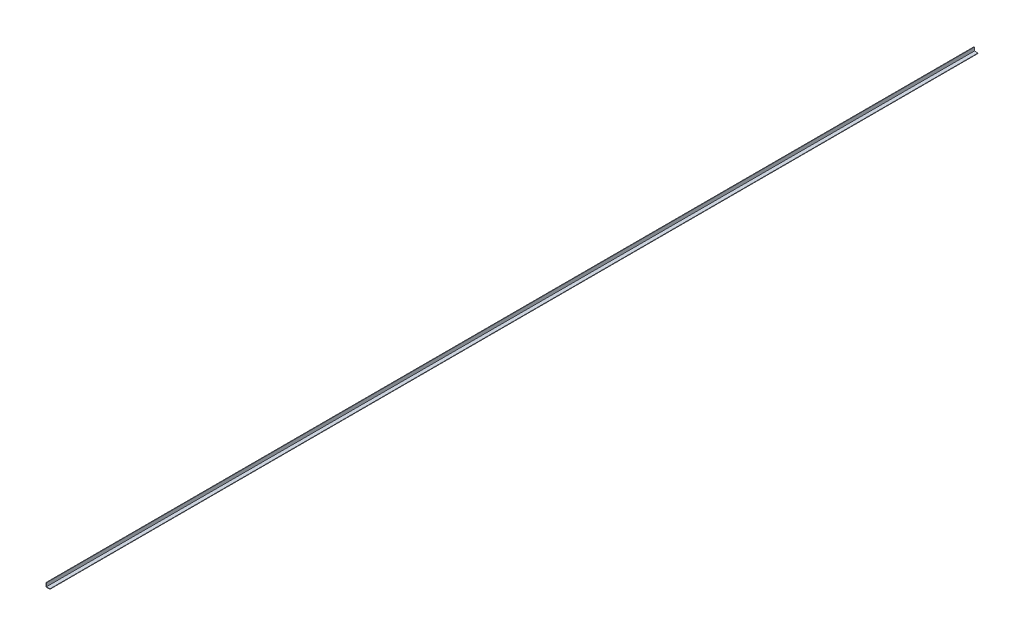
ISO-10303-21;
HEADER;
FILE_DESCRIPTION(('STEP AP214'),'2;1');
FILE_NAME('part.step','',(''),(''),'','','');
FILE_SCHEMA(('AUTOMOTIVE_DESIGN { 1 0 10303 214 1 1 1 1 }'));
ENDSEC;
DATA;
#1=APPLICATION_CONTEXT('core data for automotive mechanical design processes');
#2=APPLICATION_PROTOCOL_DEFINITION('international standard','automotive_design',2000,#1);
#3=PRODUCT_CONTEXT('',#1,'mechanical');
#4=PRODUCT('Part','Part','',(#3));
#5=PRODUCT_RELATED_PRODUCT_CATEGORY('part','',(#4));
#6=PRODUCT_DEFINITION_FORMATION('','',#4);
#7=PRODUCT_DEFINITION_CONTEXT('part definition',#1,'design');
#8=PRODUCT_DEFINITION('design','',#6,#7);
#9=PRODUCT_DEFINITION_SHAPE('','',#8);
#10=(LENGTH_UNIT() NAMED_UNIT(*) SI_UNIT(.MILLI.,.METRE.));
#11=(NAMED_UNIT(*) PLANE_ANGLE_UNIT() SI_UNIT($,.RADIAN.));
#12=(NAMED_UNIT(*) SI_UNIT($,.STERADIAN.) SOLID_ANGLE_UNIT());
#13=UNCERTAINTY_MEASURE_WITH_UNIT(LENGTH_MEASURE(1.E-05),#10,'distance_accuracy_value','');
#14=(GEOMETRIC_REPRESENTATION_CONTEXT(3) GLOBAL_UNCERTAINTY_ASSIGNED_CONTEXT((#13)) GLOBAL_UNIT_ASSIGNED_CONTEXT((#10,
#11,#12)) REPRESENTATION_CONTEXT('',''));
#15=CARTESIAN_POINT('',(0.,0.,0.));
#16=DIRECTION('',(0.,0.,1.));
#17=DIRECTION('',(1.,0.,0.));
#18=AXIS2_PLACEMENT_3D('',#15,#16,#17);
#19=CARTESIAN_POINT('',(2.7,25.8,-6100.));
#20=DIRECTION('',(0.,1.,0.));
#21=DIRECTION('',(0.,0.,1.));
#22=AXIS2_PLACEMENT_3D('',#19,#20,#21);
#23=PLANE('',#22);
#24=DIRECTION('',(-1.,0.,0.));
#25=VECTOR('',#24,1.);
#26=CARTESIAN_POINT('',(2.7,25.8,0.));
#27=LINE('',#26,#25);
#28=CARTESIAN_POINT('',(2.7,25.8,0.));
#29=VERTEX_POINT('',#28);
#30=CARTESIAN_POINT('',(0.,25.8,0.));
#31=VERTEX_POINT('',#30);
#32=EDGE_CURVE('E118',#29,#31,#27,.T.);
#33=ORIENTED_EDGE('',*,*,#32,.F.);
#34=DIRECTION('',(0.,0.,1.));
#35=VECTOR('',#34,1.);
#36=CARTESIAN_POINT('',(2.7,25.8,-6100.));
#37=LINE('',#36,#35);
#38=CARTESIAN_POINT('',(2.7,25.8,-6100.));
#39=VERTEX_POINT('',#38);
#40=EDGE_CURVE('E11',#39,#29,#37,.T.);
#41=ORIENTED_EDGE('',*,*,#40,.F.);
#42=DIRECTION('',(-1.,0.,0.));
#43=VECTOR('',#42,1.);
#44=CARTESIAN_POINT('',(2.7,25.8,-6100.));
#45=LINE('',#44,#43);
#46=CARTESIAN_POINT('',(0.,25.8,-6100.));
#47=VERTEX_POINT('',#46);
#48=EDGE_CURVE('E132',#39,#47,#45,.T.);
#49=ORIENTED_EDGE('',*,*,#48,.T.);
#50=DIRECTION('',(0.,0.,1.));
#51=VECTOR('',#50,1.);
#52=CARTESIAN_POINT('',(0.,25.8,-6100.));
#53=LINE('',#52,#51);
#54=EDGE_CURVE('E36',#47,#31,#53,.T.);
#55=ORIENTED_EDGE('',*,*,#54,.T.);
#56=EDGE_LOOP('',(#33,#41,#49,#55));
#57=FACE_BOUND('',#56,.T.);
#58=ADVANCED_FACE('F33',(#57),#23,.T.);
#59=CARTESIAN_POINT('',(2.7,2.7,-6100.));
#60=DIRECTION('',(1.,0.,0.));
#61=DIRECTION('',(0.,1.,0.));
#62=AXIS2_PLACEMENT_3D('',#59,#60,#61);
#63=PLANE('',#62);
#64=DIRECTION('',(0.,1.,0.));
#65=VECTOR('',#64,1.);
#66=CARTESIAN_POINT('',(2.7,2.7,0.));
#67=LINE('',#66,#65);
#68=CARTESIAN_POINT('',(2.7,2.7,0.));
#69=VERTEX_POINT('',#68);
#70=EDGE_CURVE('E130',#69,#29,#67,.T.);
#71=ORIENTED_EDGE('',*,*,#70,.F.);
#72=DIRECTION('',(0.,0.,1.));
#73=VECTOR('',#72,1.);
#74=CARTESIAN_POINT('',(2.7,2.7,-6100.));
#75=LINE('',#74,#73);
#76=CARTESIAN_POINT('',(2.7,2.7,-6100.));
#77=VERTEX_POINT('',#76);
#78=EDGE_CURVE('E42',#77,#69,#75,.T.);
#79=ORIENTED_EDGE('',*,*,#78,.F.);
#80=DIRECTION('',(0.,1.,0.));
#81=VECTOR('',#80,1.);
#82=CARTESIAN_POINT('',(2.7,2.7,-6100.));
#83=LINE('',#82,#81);
#84=EDGE_CURVE('E108',#77,#39,#83,.T.);
#85=ORIENTED_EDGE('',*,*,#84,.T.);
#86=ORIENTED_EDGE('',*,*,#40,.T.);
#87=EDGE_LOOP('',(#71,#79,#85,#86));
#88=FACE_BOUND('',#87,.T.);
#89=ADVANCED_FACE('F140',(#88),#63,.T.);
#90=CARTESIAN_POINT('',(25.8,2.7,-6100.));
#91=DIRECTION('',(0.,1.,0.));
#92=DIRECTION('',(-1.,0.,0.));
#93=AXIS2_PLACEMENT_3D('',#90,#91,#92);
#94=PLANE('',#93);
#95=DIRECTION('',(-1.,0.,0.));
#96=VECTOR('',#95,1.);
#97=CARTESIAN_POINT('',(25.8,2.7,0.));
#98=LINE('',#97,#96);
#99=CARTESIAN_POINT('',(25.8,2.7,0.));
#100=VERTEX_POINT('',#99);
#101=EDGE_CURVE('E95',#100,#69,#98,.T.);
#102=ORIENTED_EDGE('',*,*,#101,.F.);
#103=DIRECTION('',(0.,0.,1.));
#104=VECTOR('',#103,1.);
#105=CARTESIAN_POINT('',(25.8,2.7,-6100.));
#106=LINE('',#105,#104);
#107=CARTESIAN_POINT('',(25.8,2.7,-6100.));
#108=VERTEX_POINT('',#107);
#109=EDGE_CURVE('E90',#108,#100,#106,.T.);
#110=ORIENTED_EDGE('',*,*,#109,.F.);
#111=DIRECTION('',(-1.,0.,0.));
#112=VECTOR('',#111,1.);
#113=CARTESIAN_POINT('',(25.8,2.7,-6100.));
#114=LINE('',#113,#112);
#115=EDGE_CURVE('E93',#108,#77,#114,.T.);
#116=ORIENTED_EDGE('',*,*,#115,.T.);
#117=ORIENTED_EDGE('',*,*,#78,.T.);
#118=EDGE_LOOP('',(#102,#110,#116,#117));
#119=FACE_BOUND('',#118,.T.);
#120=ADVANCED_FACE('F92',(#119),#94,.T.);
#121=CARTESIAN_POINT('',(25.8,0.,-6100.));
#122=DIRECTION('',(1.,0.,0.));
#123=DIRECTION('',(0.,0.,-1.));
#124=AXIS2_PLACEMENT_3D('',#121,#122,#123);
#125=PLANE('',#124);
#126=DIRECTION('',(0.,1.,0.));
#127=VECTOR('',#126,1.);
#128=CARTESIAN_POINT('',(25.8,0.,0.));
#129=LINE('',#128,#127);
#130=CARTESIAN_POINT('',(25.8,0.,0.));
#131=VERTEX_POINT('',#130);
#132=EDGE_CURVE('E127',#131,#100,#129,.T.);
#133=ORIENTED_EDGE('',*,*,#132,.F.);
#134=DIRECTION('',(0.,0.,1.));
#135=VECTOR('',#134,1.);
#136=CARTESIAN_POINT('',(25.8,0.,-6100.));
#137=LINE('',#136,#135);
#138=CARTESIAN_POINT('',(25.8,0.,-6100.));
#139=VERTEX_POINT('',#138);
#140=EDGE_CURVE('E100',#139,#131,#137,.T.);
#141=ORIENTED_EDGE('',*,*,#140,.F.);
#142=DIRECTION('',(0.,1.,0.));
#143=VECTOR('',#142,1.);
#144=CARTESIAN_POINT('',(25.8,0.,-6100.));
#145=LINE('',#144,#143);
#146=EDGE_CURVE('E106',#139,#108,#145,.T.);
#147=ORIENTED_EDGE('',*,*,#146,.T.);
#148=ORIENTED_EDGE('',*,*,#109,.T.);
#149=EDGE_LOOP('',(#133,#141,#147,#148));
#150=FACE_BOUND('',#149,.T.);
#151=ADVANCED_FACE('F110',(#150),#125,.T.);
#152=CARTESIAN_POINT('',(0.,0.,-6100.));
#153=DIRECTION('',(0.,-1.,0.));
#154=DIRECTION('',(0.,0.,-1.));
#155=AXIS2_PLACEMENT_3D('',#152,#153,#154);
#156=PLANE('',#155);
#157=DIRECTION('',(1.,0.,0.));
#158=VECTOR('',#157,1.);
#159=CARTESIAN_POINT('',(0.,0.,0.));
#160=LINE('',#159,#158);
#161=CARTESIAN_POINT('',(0.,0.,0.));
#162=VERTEX_POINT('',#161);
#163=EDGE_CURVE('E124',#162,#131,#160,.T.);
#164=ORIENTED_EDGE('',*,*,#163,.F.);
#165=DIRECTION('',(0.,0.,1.));
#166=VECTOR('',#165,1.);
#167=CARTESIAN_POINT('',(0.,0.,-6100.));
#168=LINE('',#167,#166);
#169=CARTESIAN_POINT('',(0.,0.,-6100.));
#170=VERTEX_POINT('',#169);
#171=EDGE_CURVE('E135',#170,#162,#168,.T.);
#172=ORIENTED_EDGE('',*,*,#171,.F.);
#173=DIRECTION('',(1.,0.,0.));
#174=VECTOR('',#173,1.);
#175=CARTESIAN_POINT('',(0.,0.,-6100.));
#176=LINE('',#175,#174);
#177=EDGE_CURVE('E111',#170,#139,#176,.T.);
#178=ORIENTED_EDGE('',*,*,#177,.T.);
#179=ORIENTED_EDGE('',*,*,#140,.T.);
#180=EDGE_LOOP('',(#164,#172,#178,#179));
#181=FACE_BOUND('',#180,.T.);
#182=ADVANCED_FACE('F153',(#181),#156,.T.);
#183=CARTESIAN_POINT('',(0.,25.8,-6100.));
#184=DIRECTION('',(-1.,0.,0.));
#185=DIRECTION('',(0.,-1.,0.));
#186=AXIS2_PLACEMENT_3D('',#183,#184,#185);
#187=PLANE('',#186);
#188=DIRECTION('',(0.,-1.,0.));
#189=VECTOR('',#188,1.);
#190=CARTESIAN_POINT('',(0.,25.8,0.));
#191=LINE('',#190,#189);
#192=EDGE_CURVE('E121',#31,#162,#191,.T.);
#193=ORIENTED_EDGE('',*,*,#192,.F.);
#194=ORIENTED_EDGE('',*,*,#54,.F.);
#195=DIRECTION('',(0.,-1.,0.));
#196=VECTOR('',#195,1.);
#197=CARTESIAN_POINT('',(0.,25.8,-6100.));
#198=LINE('',#197,#196);
#199=EDGE_CURVE('E113',#47,#170,#198,.T.);
#200=ORIENTED_EDGE('',*,*,#199,.T.);
#201=ORIENTED_EDGE('',*,*,#171,.T.);
#202=EDGE_LOOP('',(#193,#194,#200,#201));
#203=FACE_BOUND('',#202,.T.);
#204=ADVANCED_FACE('F137',(#203),#187,.T.);
#205=CARTESIAN_POINT('',(0.,0.,-6100.));
#206=DIRECTION('',(0.,0.,1.));
#207=DIRECTION('',(1.,0.,0.));
#208=AXIS2_PLACEMENT_3D('',#205,#206,#207);
#209=PLANE('',#208);
#210=ORIENTED_EDGE('',*,*,#48,.F.);
#211=ORIENTED_EDGE('',*,*,#84,.F.);
#212=ORIENTED_EDGE('',*,*,#115,.F.);
#213=ORIENTED_EDGE('',*,*,#146,.F.);
#214=ORIENTED_EDGE('',*,*,#177,.F.);
#215=ORIENTED_EDGE('',*,*,#199,.F.);
#216=EDGE_LOOP('',(#210,#211,#212,#213,#214,#215));
#217=FACE_BOUND('',#216,.T.);
#218=ADVANCED_FACE('F104',(#217),#209,.F.);
#219=CARTESIAN_POINT('',(0.,0.,0.));
#220=DIRECTION('',(0.,0.,1.));
#221=DIRECTION('',(1.,0.,0.));
#222=AXIS2_PLACEMENT_3D('',#219,#220,#221);
#223=PLANE('',#222);
#224=ORIENTED_EDGE('',*,*,#32,.T.);
#225=ORIENTED_EDGE('',*,*,#192,.T.);
#226=ORIENTED_EDGE('',*,*,#163,.T.);
#227=ORIENTED_EDGE('',*,*,#132,.T.);
#228=ORIENTED_EDGE('',*,*,#101,.T.);
#229=ORIENTED_EDGE('',*,*,#70,.T.);
#230=EDGE_LOOP('',(#224,#225,#226,#227,#228,#229));
#231=FACE_BOUND('',#230,.T.);
#232=ADVANCED_FACE('F139',(#231),#223,.T.);
#233=CLOSED_SHELL('',(#58,#89,#120,#151,#182,#204,#218,#232));
#234=MANIFOLD_SOLID_BREP('B2',#233);
#235=ADVANCED_BREP_SHAPE_REPRESENTATION('',(#18,#234),#14);
#236=SHAPE_DEFINITION_REPRESENTATION(#9,#235);
ENDSEC;
END-ISO-10303-21;
